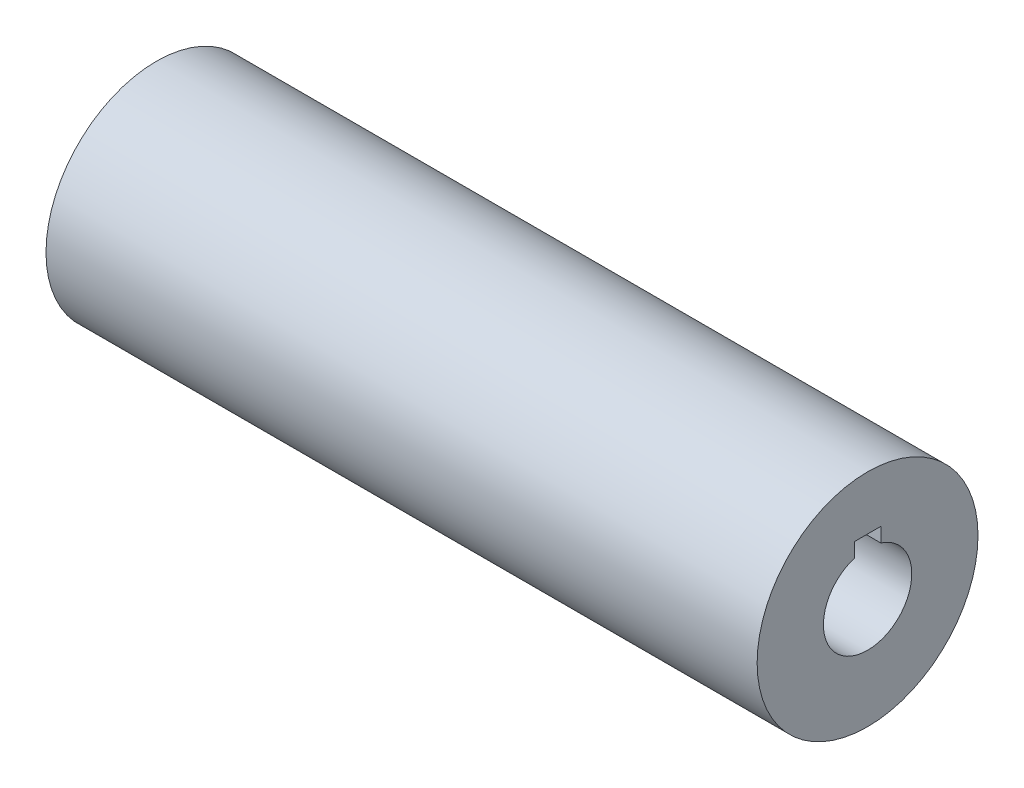
ISO-10303-21;
HEADER;
FILE_DESCRIPTION(('STEP AP214'),'2;1');
FILE_NAME('part.step','',(''),(''),'','','');
FILE_SCHEMA(('AUTOMOTIVE_DESIGN { 1 0 10303 214 1 1 1 1 }'));
ENDSEC;
DATA;
#1=APPLICATION_CONTEXT('core data for automotive mechanical design processes');
#2=APPLICATION_PROTOCOL_DEFINITION('international standard','automotive_design',2000,#1);
#3=PRODUCT_CONTEXT('',#1,'mechanical');
#4=PRODUCT('Part','Part','',(#3));
#5=PRODUCT_RELATED_PRODUCT_CATEGORY('part','',(#4));
#6=PRODUCT_DEFINITION_FORMATION('','',#4);
#7=PRODUCT_DEFINITION_CONTEXT('part definition',#1,'design');
#8=PRODUCT_DEFINITION('design','',#6,#7);
#9=PRODUCT_DEFINITION_SHAPE('','',#8);
#10=(LENGTH_UNIT() NAMED_UNIT(*) SI_UNIT(.MILLI.,.METRE.));
#11=(NAMED_UNIT(*) PLANE_ANGLE_UNIT() SI_UNIT($,.RADIAN.));
#12=(NAMED_UNIT(*) SI_UNIT($,.STERADIAN.) SOLID_ANGLE_UNIT());
#13=UNCERTAINTY_MEASURE_WITH_UNIT(LENGTH_MEASURE(1.E-05),#10,'distance_accuracy_value','');
#14=(GEOMETRIC_REPRESENTATION_CONTEXT(3) GLOBAL_UNCERTAINTY_ASSIGNED_CONTEXT((#13)) GLOBAL_UNIT_ASSIGNED_CONTEXT((#10,
#11,#12)) REPRESENTATION_CONTEXT('',''));
#15=CARTESIAN_POINT('',(0.,0.,0.));
#16=DIRECTION('',(0.,0.,1.));
#17=DIRECTION('',(1.,0.,0.));
#18=AXIS2_PLACEMENT_3D('',#15,#16,#17);
#19=CARTESIAN_POINT('',(80.5,0.,0.));
#20=DIRECTION('',(1.,0.,0.));
#21=DIRECTION('',(0.,0.,-1.));
#22=AXIS2_PLACEMENT_3D('',#19,#20,#21);
#23=PLANE('',#22);
#24=CARTESIAN_POINT('',(80.5,0.,0.));
#25=DIRECTION('',(1.,0.,0.));
#26=DIRECTION('',(0.,0.,-1.));
#27=AXIS2_PLACEMENT_3D('',#24,#25,#26);
#28=CIRCLE('',#27,25.);
#29=CARTESIAN_POINT('',(80.5,0.,-25.));
#30=VERTEX_POINT('',#29);
#31=EDGE_CURVE('E109',#30,#30,#28,.T.);
#32=ORIENTED_EDGE('',*,*,#31,.T.);
#33=EDGE_LOOP('',(#32));
#34=FACE_BOUND('',#33,.T.);
#35=CARTESIAN_POINT('',(80.5,0.,0.));
#36=DIRECTION('',(1.,0.,0.));
#37=DIRECTION('',(0.,0.,-1.));
#38=AXIS2_PLACEMENT_3D('',#35,#36,#37);
#39=CIRCLE('',#38,10.);
#40=CARTESIAN_POINT('',(80.5,9.53939201416945,3.));
#41=VERTEX_POINT('',#40);
#42=CARTESIAN_POINT('',(80.5,9.53939201416945,-3.));
#43=VERTEX_POINT('',#42);
#44=EDGE_CURVE('E104',#41,#43,#39,.T.);
#45=ORIENTED_EDGE('',*,*,#44,.F.);
#46=DIRECTION('',(0.,1.,0.));
#47=VECTOR('',#46,1.);
#48=CARTESIAN_POINT('',(80.5,7.2,3.));
#49=LINE('',#48,#47);
#50=CARTESIAN_POINT('',(80.5,12.8,3.));
#51=VERTEX_POINT('',#50);
#52=EDGE_CURVE('E94',#41,#51,#49,.T.);
#53=ORIENTED_EDGE('',*,*,#52,.T.);
#54=DIRECTION('',(0.,0.,-1.));
#55=VECTOR('',#54,1.);
#56=CARTESIAN_POINT('',(80.5,12.8,3.));
#57=LINE('',#56,#55);
#58=CARTESIAN_POINT('',(80.5,12.8,-3.));
#59=VERTEX_POINT('',#58);
#60=EDGE_CURVE('E97',#51,#59,#57,.T.);
#61=ORIENTED_EDGE('',*,*,#60,.T.);
#62=DIRECTION('',(0.,1.,0.));
#63=VECTOR('',#62,1.);
#64=CARTESIAN_POINT('',(80.5,7.2,-3.));
#65=LINE('',#64,#63);
#66=EDGE_CURVE('E88',#43,#59,#65,.T.);
#67=ORIENTED_EDGE('',*,*,#66,.F.);
#68=EDGE_LOOP('',(#45,#53,#61,#67));
#69=FACE_BOUND('',#68,.T.);
#70=ADVANCED_FACE('F36',(#34,#69),#23,.T.);
#71=CARTESIAN_POINT('',(-80.5,0.,0.));
#72=DIRECTION('',(1.,0.,0.));
#73=DIRECTION('',(0.,0.,-1.));
#74=AXIS2_PLACEMENT_3D('',#71,#72,#73);
#75=PLANE('',#74);
#76=CARTESIAN_POINT('',(-80.5,0.,0.));
#77=DIRECTION('',(1.,0.,0.));
#78=DIRECTION('',(0.,0.,-1.));
#79=AXIS2_PLACEMENT_3D('',#76,#77,#78);
#80=CIRCLE('',#79,25.);
#81=CARTESIAN_POINT('',(-80.5,0.,-25.));
#82=VERTEX_POINT('',#81);
#83=EDGE_CURVE('E107',#82,#82,#80,.T.);
#84=ORIENTED_EDGE('',*,*,#83,.F.);
#85=EDGE_LOOP('',(#84));
#86=FACE_BOUND('',#85,.T.);
#87=DIRECTION('',(0.,1.,0.));
#88=VECTOR('',#87,1.);
#89=CARTESIAN_POINT('',(-80.5,7.2,3.));
#90=LINE('',#89,#88);
#91=CARTESIAN_POINT('',(-80.5,9.53939201416945,3.));
#92=VERTEX_POINT('',#91);
#93=CARTESIAN_POINT('',(-80.5,12.8,3.));
#94=VERTEX_POINT('',#93);
#95=EDGE_CURVE('E84',#92,#94,#90,.T.);
#96=ORIENTED_EDGE('',*,*,#95,.F.);
#97=CARTESIAN_POINT('',(-80.5,0.,0.));
#98=DIRECTION('',(1.,0.,0.));
#99=DIRECTION('',(0.,0.,-1.));
#100=AXIS2_PLACEMENT_3D('',#97,#98,#99);
#101=CIRCLE('',#100,10.);
#102=CARTESIAN_POINT('',(-80.5,9.53939201416945,-3.));
#103=VERTEX_POINT('',#102);
#104=EDGE_CURVE('E93',#92,#103,#101,.T.);
#105=ORIENTED_EDGE('',*,*,#104,.T.);
#106=DIRECTION('',(0.,1.,0.));
#107=VECTOR('',#106,1.);
#108=CARTESIAN_POINT('',(-80.5,7.2,-3.));
#109=LINE('',#108,#107);
#110=CARTESIAN_POINT('',(-80.5,12.8,-3.));
#111=VERTEX_POINT('',#110);
#112=EDGE_CURVE('E51',#103,#111,#109,.T.);
#113=ORIENTED_EDGE('',*,*,#112,.T.);
#114=DIRECTION('',(0.,0.,-1.));
#115=VECTOR('',#114,1.);
#116=CARTESIAN_POINT('',(-80.5,12.8,3.));
#117=LINE('',#116,#115);
#118=EDGE_CURVE('E77',#94,#111,#117,.T.);
#119=ORIENTED_EDGE('',*,*,#118,.F.);
#120=EDGE_LOOP('',(#96,#105,#113,#119));
#121=FACE_BOUND('',#120,.T.);
#122=ADVANCED_FACE('F91',(#86,#121),#75,.F.);
#123=CARTESIAN_POINT('',(80.5,0.,0.));
#124=DIRECTION('',(-1.,0.,0.));
#125=DIRECTION('',(0.,0.,1.));
#126=AXIS2_PLACEMENT_3D('',#123,#124,#125);
#127=CYLINDRICAL_SURFACE('',#126,10.);
#128=ORIENTED_EDGE('',*,*,#104,.F.);
#129=DIRECTION('',(-1.,0.,0.));
#130=VECTOR('',#129,1.);
#131=CARTESIAN_POINT('',(80.5,9.53939201416945,3.));
#132=LINE('',#131,#130);
#133=EDGE_CURVE('E11',#92,#41,#132,.F.);
#134=ORIENTED_EDGE('',*,*,#133,.T.);
#135=ORIENTED_EDGE('',*,*,#44,.T.);
#136=DIRECTION('',(-1.,0.,0.));
#137=VECTOR('',#136,1.);
#138=CARTESIAN_POINT('',(80.5,9.53939201416945,-3.));
#139=LINE('',#138,#137);
#140=EDGE_CURVE('E44',#103,#43,#139,.F.);
#141=ORIENTED_EDGE('',*,*,#140,.F.);
#142=EDGE_LOOP('',(#128,#134,#135,#141));
#143=FACE_BOUND('',#142,.T.);
#144=ADVANCED_FACE('F116',(#143),#127,.F.);
#145=CARTESIAN_POINT('',(80.5,0.,0.));
#146=DIRECTION('',(-1.,0.,0.));
#147=DIRECTION('',(0.,0.,1.));
#148=AXIS2_PLACEMENT_3D('',#145,#146,#147);
#149=CYLINDRICAL_SURFACE('',#148,25.);
#150=ORIENTED_EDGE('',*,*,#31,.F.);
#151=EDGE_LOOP('',(#150));
#152=FACE_BOUND('',#151,.T.);
#153=ORIENTED_EDGE('',*,*,#83,.T.);
#154=EDGE_LOOP('',(#153));
#155=FACE_BOUND('',#154,.T.);
#156=ADVANCED_FACE('F38',(#152,#155),#149,.T.);
#157=CARTESIAN_POINT('',(-80.5,7.2,3.));
#158=DIRECTION('',(0.,0.,-1.));
#159=DIRECTION('',(0.,1.,0.));
#160=AXIS2_PLACEMENT_3D('',#157,#158,#159);
#161=PLANE('',#160);
#162=ORIENTED_EDGE('',*,*,#95,.T.);
#163=DIRECTION('',(1.,0.,0.));
#164=VECTOR('',#163,1.);
#165=CARTESIAN_POINT('',(-80.5,12.8,3.));
#166=LINE('',#165,#164);
#167=EDGE_CURVE('E82',#94,#51,#166,.T.);
#168=ORIENTED_EDGE('',*,*,#167,.T.);
#169=ORIENTED_EDGE('',*,*,#52,.F.);
#170=ORIENTED_EDGE('',*,*,#133,.F.);
#171=EDGE_LOOP('',(#162,#168,#169,#170));
#172=FACE_BOUND('',#171,.T.);
#173=ADVANCED_FACE('F123',(#172),#161,.T.);
#174=CARTESIAN_POINT('',(-80.5,12.8,3.));
#175=DIRECTION('',(0.,-1.,0.));
#176=DIRECTION('',(0.,0.,-1.));
#177=AXIS2_PLACEMENT_3D('',#174,#175,#176);
#178=PLANE('',#177);
#179=ORIENTED_EDGE('',*,*,#60,.F.);
#180=ORIENTED_EDGE('',*,*,#167,.F.);
#181=ORIENTED_EDGE('',*,*,#118,.T.);
#182=DIRECTION('',(1.,0.,0.));
#183=VECTOR('',#182,1.);
#184=CARTESIAN_POINT('',(-80.5,12.8,-3.));
#185=LINE('',#184,#183);
#186=EDGE_CURVE('E80',#111,#59,#185,.T.);
#187=ORIENTED_EDGE('',*,*,#186,.T.);
#188=EDGE_LOOP('',(#179,#180,#181,#187));
#189=FACE_BOUND('',#188,.T.);
#190=ADVANCED_FACE('F79',(#189),#178,.T.);
#191=CARTESIAN_POINT('',(-80.5,7.2,-3.));
#192=DIRECTION('',(0.,0.,-1.));
#193=DIRECTION('',(0.,1.,0.));
#194=AXIS2_PLACEMENT_3D('',#191,#192,#193);
#195=PLANE('',#194);
#196=ORIENTED_EDGE('',*,*,#140,.T.);
#197=ORIENTED_EDGE('',*,*,#66,.T.);
#198=ORIENTED_EDGE('',*,*,#186,.F.);
#199=ORIENTED_EDGE('',*,*,#112,.F.);
#200=EDGE_LOOP('',(#196,#197,#198,#199));
#201=FACE_BOUND('',#200,.T.);
#202=ADVANCED_FACE('F86',(#201),#195,.F.);
#203=CLOSED_SHELL('',(#70,#122,#144,#156,#173,#190,#202));
#204=MANIFOLD_SOLID_BREP('B2',#203);
#205=ADVANCED_BREP_SHAPE_REPRESENTATION('',(#18,#204),#14);
#206=SHAPE_DEFINITION_REPRESENTATION(#9,#205);
ENDSEC;
END-ISO-10303-21;
